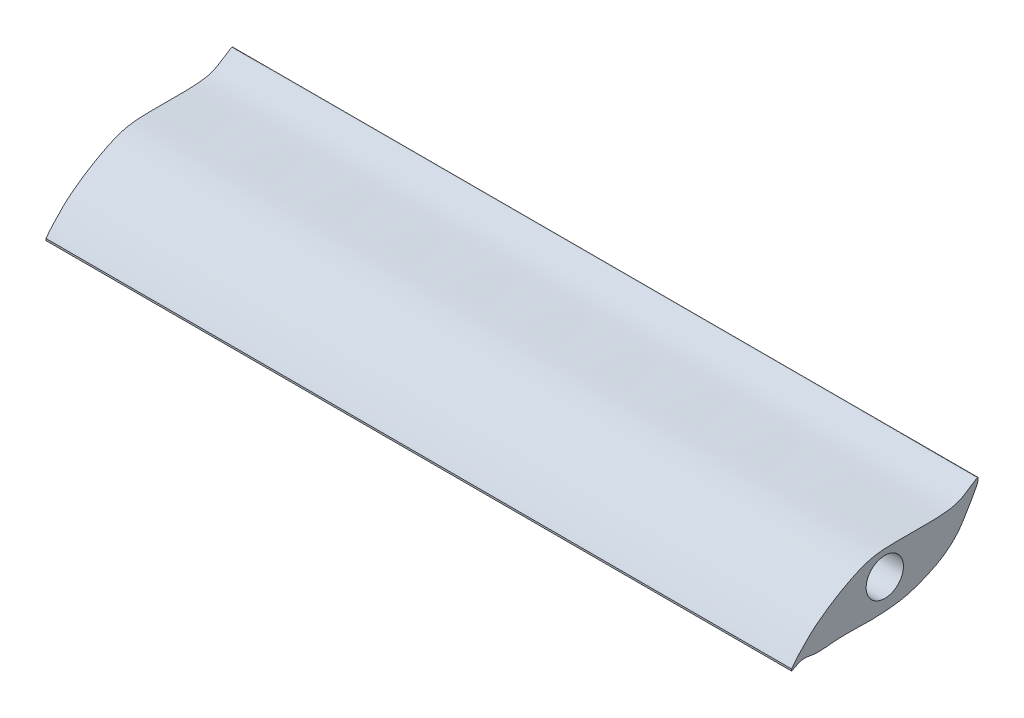
ISO-10303-21;
HEADER;
FILE_DESCRIPTION(('STEP AP214'),'2;1');
FILE_NAME('part.step','',(''),(''),'','','');
FILE_SCHEMA(('AUTOMOTIVE_DESIGN { 1 0 10303 214 1 1 1 1 }'));
ENDSEC;
DATA;
#1=APPLICATION_CONTEXT('core data for automotive mechanical design processes');
#2=APPLICATION_PROTOCOL_DEFINITION('international standard','automotive_design',2000,#1);
#3=PRODUCT_CONTEXT('',#1,'mechanical');
#4=PRODUCT('Part','Part','',(#3));
#5=PRODUCT_RELATED_PRODUCT_CATEGORY('part','',(#4));
#6=PRODUCT_DEFINITION_FORMATION('','',#4);
#7=PRODUCT_DEFINITION_CONTEXT('part definition',#1,'design');
#8=PRODUCT_DEFINITION('design','',#6,#7);
#9=PRODUCT_DEFINITION_SHAPE('','',#8);
#10=(LENGTH_UNIT() NAMED_UNIT(*) SI_UNIT(.MILLI.,.METRE.));
#11=(NAMED_UNIT(*) PLANE_ANGLE_UNIT() SI_UNIT($,.RADIAN.));
#12=(NAMED_UNIT(*) SI_UNIT($,.STERADIAN.) SOLID_ANGLE_UNIT());
#13=UNCERTAINTY_MEASURE_WITH_UNIT(LENGTH_MEASURE(1.E-05),#10,'distance_accuracy_value','');
#14=(GEOMETRIC_REPRESENTATION_CONTEXT(3) GLOBAL_UNCERTAINTY_ASSIGNED_CONTEXT((#13)) GLOBAL_UNIT_ASSIGNED_CONTEXT((#10,
#11,#12)) REPRESENTATION_CONTEXT('',''));
#15=CARTESIAN_POINT('',(0.,0.,0.));
#16=DIRECTION('',(0.,0.,1.));
#17=DIRECTION('',(1.,0.,0.));
#18=AXIS2_PLACEMENT_3D('',#15,#16,#17);
#19=CARTESIAN_POINT('',(50.,10.,-12.5));
#20=DIRECTION('',(-1.,0.,0.));
#21=DIRECTION('',(0.,0.,1.));
#22=AXIS2_PLACEMENT_3D('',#19,#20,#21);
#23=PLANE('',#22);
#24=CARTESIAN_POINT('',(50.,4.68747783797203,0.));
#25=DIRECTION('',(1.,0.,0.));
#26=DIRECTION('',(0.,0.,-1.));
#27=AXIS2_PLACEMENT_3D('',#24,#25,#26);
#28=CIRCLE('',#27,2.5);
#29=CARTESIAN_POINT('',(50.,4.68747783797203,-2.49999999999999));
#30=VERTEX_POINT('',#29);
#31=EDGE_CURVE('E136',#30,#30,#28,.T.);
#32=ORIENTED_EDGE('',*,*,#31,.F.);
#33=EDGE_LOOP('',(#32));
#34=FACE_BOUND('',#33,.T.);
#35=CARTESIAN_POINT('',(50.,0.,12.5));
#36=CARTESIAN_POINT('',(50.,0.0505909525154727,12.3095714462442));
#37=CARTESIAN_POINT('',(50.,0.853496137975972,11.1191477400608));
#38=CARTESIAN_POINT('',(50.,0.217248552112614,9.16863951643412));
#39=CARTESIAN_POINT('',(50.,0.751781994938175,6.42498448935654));
#40=CARTESIAN_POINT('',(50.,0.565528175692752,3.31005256994757));
#41=CARTESIAN_POINT('',(50.,0.598462484155129,0.192428753146038));
#42=CARTESIAN_POINT('',(50.,0.955309651411269,-2.95137379306609));
#43=CARTESIAN_POINT('',(50.,2.05734399254038,-5.84648168384962));
#44=CARTESIAN_POINT('',(50.,3.29384365054436,-8.17806777558693));
#45=CARTESIAN_POINT('',(50.,5.06347867764964,-9.979186998167));
#46=CARTESIAN_POINT('',(50.,6.85194167648177,-11.0533997702852));
#47=CARTESIAN_POINT('',(50.,11.1336555204317,-13.5699200463223));
#48=CARTESIAN_POINT('',(50.,8.51082596856558,-10.4191218151853));
#49=CARTESIAN_POINT('',(50.,8.00099794507966,-7.9131718769337));
#50=CARTESIAN_POINT('',(50.,8.02264938764246,-4.81055421615805));
#51=CARTESIAN_POINT('',(50.,8.02662364286193,-1.40561642102689));
#52=CARTESIAN_POINT('',(50.,7.984803810928,1.77524115155495));
#53=CARTESIAN_POINT('',(50.,6.61449638591342,4.74663763450107));
#54=CARTESIAN_POINT('',(50.,5.32010119566645,7.03105032868429));
#55=CARTESIAN_POINT('',(50.,3.83731609732269,9.08843489706636));
#56=CARTESIAN_POINT('',(50.,2.57459806859156,10.5650013430778));
#57=CARTESIAN_POINT('',(50.,-0.122781782519777,12.9621608431991));
#58=CARTESIAN_POINT('',(50.,0.,12.5));
#59=B_SPLINE_CURVE_WITH_KNOTS('',3,(#35,#36,#37,#38,#39,#40,#41,#42,#43,#44,#45,#46,#47,#48,#49,
#50,#51,#52,#53,#54,#55,#56,#57,#58),.UNSPECIFIED.,.T.,.F.,(4,1,1,1,1,1,1,1,1,1,1,1,1,1,1,1,1,1,
1,1,1,4),(0.,0.0223723162679839,0.0519405725869165,0.108024940918717,0.162660145847367,
0.215350044192618,0.270500486683988,0.326752240442378,0.375469283157597,0.408785139055256,
0.452001777653556,0.509743818199002,0.548425408917011,0.589864191643741,0.658193707073828,
0.703350788719513,0.769672760581713,0.820814366281576,0.87101676844652,0.909382783698528,
0.945703475939909,1.),.UNSPECIFIED.);
#60=CARTESIAN_POINT('',(50.,10.,-12.461085934828));
#61=VERTEX_POINT('',#60);
#62=CARTESIAN_POINT('',(50.,0.2438790571685,12.5));
#63=VERTEX_POINT('',#62);
#64=EDGE_CURVE('E61',#61,#63,#59,.T.);
#65=ORIENTED_EDGE('',*,*,#64,.T.);
#66=DIRECTION('',(0.,-1.,0.));
#67=VECTOR('',#66,1.);
#68=CARTESIAN_POINT('',(50.,10.,12.5));
#69=LINE('',#68,#67);
#70=CARTESIAN_POINT('',(50.,0.,12.5));
#71=VERTEX_POINT('',#70);
#72=EDGE_CURVE('E123',#63,#71,#69,.T.);
#73=ORIENTED_EDGE('',*,*,#72,.T.);
#74=CARTESIAN_POINT('',(50.,9.54799922694261,-12.5000000000001));
#75=VERTEX_POINT('',#74);
#76=EDGE_CURVE('E81',#71,#75,#59,.T.);
#77=ORIENTED_EDGE('',*,*,#76,.T.);
#78=DIRECTION('',(0.,-1.,0.));
#79=VECTOR('',#78,1.);
#80=CARTESIAN_POINT('',(50.,10.,-12.5));
#81=LINE('',#80,#79);
#82=CARTESIAN_POINT('',(50.,10.,-12.5));
#83=VERTEX_POINT('',#82);
#84=EDGE_CURVE('E12',#83,#75,#81,.T.);
#85=ORIENTED_EDGE('',*,*,#84,.F.);
#86=DIRECTION('',(0.,0.,-1.));
#87=VECTOR('',#86,1.);
#88=CARTESIAN_POINT('',(50.,10.,-12.5));
#89=LINE('',#88,#87);
#90=EDGE_CURVE('E107',#61,#83,#89,.T.);
#91=ORIENTED_EDGE('',*,*,#90,.F.);
#92=EDGE_LOOP('',(#65,#73,#77,#85,#91));
#93=FACE_BOUND('',#92,.T.);
#94=ADVANCED_FACE('F46',(#34,#93),#23,.F.);
#95=CARTESIAN_POINT('',(-50.,10.,-12.5));
#96=DIRECTION('',(0.,0.,1.));
#97=DIRECTION('',(1.,0.,0.));
#98=AXIS2_PLACEMENT_3D('',#95,#96,#97);
#99=PLANE('',#98);
#100=DIRECTION('',(1.,0.,0.));
#101=VECTOR('',#100,1.);
#102=CARTESIAN_POINT('',(-50.,9.5479992269426,-12.5000000000001));
#103=LINE('',#102,#101);
#104=CARTESIAN_POINT('',(-50.,9.54799923471461,-12.5000000028297));
#105=VERTEX_POINT('',#104);
#106=EDGE_CURVE('E140',#105,#75,#103,.T.);
#107=ORIENTED_EDGE('',*,*,#106,.F.);
#108=DIRECTION('',(0.,-1.,0.));
#109=VECTOR('',#108,1.);
#110=CARTESIAN_POINT('',(-50.,10.,-12.5));
#111=LINE('',#110,#109);
#112=CARTESIAN_POINT('',(-50.,10.,-12.5));
#113=VERTEX_POINT('',#112);
#114=EDGE_CURVE('E54',#113,#105,#111,.T.);
#115=ORIENTED_EDGE('',*,*,#114,.F.);
#116=DIRECTION('',(-1.,0.,0.));
#117=VECTOR('',#116,1.);
#118=CARTESIAN_POINT('',(-50.,10.,-12.5));
#119=LINE('',#118,#117);
#120=EDGE_CURVE('E70',#83,#113,#119,.T.);
#121=ORIENTED_EDGE('',*,*,#120,.F.);
#122=ORIENTED_EDGE('',*,*,#84,.T.);
#123=EDGE_LOOP('',(#107,#115,#121,#122));
#124=FACE_BOUND('',#123,.T.);
#125=ADVANCED_FACE('F176',(#124),#99,.F.);
#126=CARTESIAN_POINT('',(-50.,10.,-12.5));
#127=DIRECTION('',(1.,0.,0.));
#128=DIRECTION('',(0.,0.,-1.));
#129=AXIS2_PLACEMENT_3D('',#126,#127,#128);
#130=PLANE('',#129);
#131=CARTESIAN_POINT('',(-50.,4.68747783797203,0.));
#132=DIRECTION('',(1.,0.,0.));
#133=DIRECTION('',(0.,0.,-1.));
#134=AXIS2_PLACEMENT_3D('',#131,#132,#133);
#135=CIRCLE('',#134,2.5);
#136=CARTESIAN_POINT('',(-50.,4.68747783797203,-2.50000000000001));
#137=VERTEX_POINT('',#136);
#138=EDGE_CURVE('E108',#137,#137,#135,.T.);
#139=ORIENTED_EDGE('',*,*,#138,.T.);
#140=EDGE_LOOP('',(#139));
#141=FACE_BOUND('',#140,.T.);
#142=CARTESIAN_POINT('',(-50.,0.,12.5));
#143=CARTESIAN_POINT('',(-50.,0.0505909525154727,12.3095714462442));
#144=CARTESIAN_POINT('',(-50.,0.853496137975972,11.1191477400608));
#145=CARTESIAN_POINT('',(-50.,0.217248552112614,9.16863951643409));
#146=CARTESIAN_POINT('',(-50.,0.751781994938175,6.42498448935651));
#147=CARTESIAN_POINT('',(-50.,0.565528175692752,3.31005256994755));
#148=CARTESIAN_POINT('',(-50.,0.598462484155129,0.19242875314601));
#149=CARTESIAN_POINT('',(-50.,0.955309651411269,-2.95137379306611));
#150=CARTESIAN_POINT('',(-50.,2.05734399254038,-5.84648168384965));
#151=CARTESIAN_POINT('',(-50.,3.29384365054436,-8.17806777558696));
#152=CARTESIAN_POINT('',(-50.,5.06347867764964,-9.97918699816703));
#153=CARTESIAN_POINT('',(-50.,6.85194167648177,-11.0533997702852));
#154=CARTESIAN_POINT('',(-50.,11.1336555204317,-13.5699200463224));
#155=CARTESIAN_POINT('',(-50.,8.51082596856558,-10.4191218151853));
#156=CARTESIAN_POINT('',(-50.,8.00099794507966,-7.91317187693373));
#157=CARTESIAN_POINT('',(-50.,8.02264938764246,-4.81055421615808));
#158=CARTESIAN_POINT('',(-50.,8.02662364286193,-1.40561642102692));
#159=CARTESIAN_POINT('',(-50.,7.984803810928,1.77524115155492));
#160=CARTESIAN_POINT('',(-50.,6.61449638591342,4.74663763450104));
#161=CARTESIAN_POINT('',(-50.,5.32010119566645,7.03105032868426));
#162=CARTESIAN_POINT('',(-50.,3.83731609732269,9.08843489706634));
#163=CARTESIAN_POINT('',(-50.,2.57459806859156,10.5650013430778));
#164=CARTESIAN_POINT('',(-50.,-0.122781782519777,12.9621608431991));
#165=CARTESIAN_POINT('',(-50.,0.,12.5));
#166=B_SPLINE_CURVE_WITH_KNOTS('',3,(#142,#143,#144,#145,#146,#147,#148,#149,#150,#151,#152,
#153,#154,#155,#156,#157,#158,#159,#160,#161,#162,#163,#164,#165),.UNSPECIFIED.,.T.,.F.,(4,1,1,
1,1,1,1,1,1,1,1,1,1,1,1,1,1,1,1,1,1,4),(0.,0.0223723162679839,0.0519405725869165,
0.108024940918717,0.162660145847367,0.215350044192618,0.270500486683988,0.326752240442378,
0.375469283157597,0.408785139055256,0.452001777653556,0.509743818199002,0.548425408917011,
0.589864191643741,0.658193707073828,0.703350788719513,0.769672760581713,0.820814366281576,
0.87101676844652,0.909382783698528,0.945703475939909,1.),.UNSPECIFIED.);
#167=CARTESIAN_POINT('',(-50.,0.,12.5));
#168=VERTEX_POINT('',#167);
#169=EDGE_CURVE('E101',#168,#105,#166,.T.);
#170=ORIENTED_EDGE('',*,*,#169,.F.);
#171=DIRECTION('',(0.,-1.,0.));
#172=VECTOR('',#171,1.);
#173=CARTESIAN_POINT('',(-50.,10.,12.5));
#174=LINE('',#173,#172);
#175=CARTESIAN_POINT('',(-50.,0.243879057168484,12.5));
#176=VERTEX_POINT('',#175);
#177=EDGE_CURVE('E115',#176,#168,#174,.T.);
#178=ORIENTED_EDGE('',*,*,#177,.F.);
#179=CARTESIAN_POINT('',(-50.,10.0000000000075,-12.461085934828));
#180=VERTEX_POINT('',#179);
#181=EDGE_CURVE('E119',#180,#176,#166,.T.);
#182=ORIENTED_EDGE('',*,*,#181,.F.);
#183=DIRECTION('',(0.,0.,1.));
#184=VECTOR('',#183,1.);
#185=CARTESIAN_POINT('',(-50.,10.,-12.5));
#186=LINE('',#185,#184);
#187=EDGE_CURVE('E127',#113,#180,#186,.T.);
#188=ORIENTED_EDGE('',*,*,#187,.F.);
#189=ORIENTED_EDGE('',*,*,#114,.T.);
#190=EDGE_LOOP('',(#170,#178,#182,#188,#189));
#191=FACE_BOUND('',#190,.T.);
#192=ADVANCED_FACE('F113',(#141,#191),#130,.F.);
#193=CARTESIAN_POINT('',(-50.,10.,12.5));
#194=DIRECTION('',(0.,0.,-1.));
#195=DIRECTION('',(-1.,0.,0.));
#196=AXIS2_PLACEMENT_3D('',#193,#194,#195);
#197=PLANE('',#196);
#198=DIRECTION('',(1.,0.,0.));
#199=VECTOR('',#198,1.);
#200=CARTESIAN_POINT('',(-50.,0.243879057168492,12.5));
#201=LINE('',#200,#199);
#202=EDGE_CURVE('E86',#176,#63,#201,.T.);
#203=ORIENTED_EDGE('',*,*,#202,.F.);
#204=ORIENTED_EDGE('',*,*,#177,.T.);
#205=DIRECTION('',(1.,0.,0.));
#206=VECTOR('',#205,1.);
#207=CARTESIAN_POINT('',(-50.,0.,12.5));
#208=LINE('',#207,#206);
#209=EDGE_CURVE('E98',#168,#71,#208,.T.);
#210=ORIENTED_EDGE('',*,*,#209,.T.);
#211=ORIENTED_EDGE('',*,*,#72,.F.);
#212=EDGE_LOOP('',(#203,#204,#210,#211));
#213=FACE_BOUND('',#212,.T.);
#214=ADVANCED_FACE('F121',(#213),#197,.F.);
#215=CARTESIAN_POINT('',(0.,10.,0.));
#216=DIRECTION('',(0.,1.,0.));
#217=DIRECTION('',(0.,0.,1.));
#218=AXIS2_PLACEMENT_3D('',#215,#216,#217);
#219=PLANE('',#218);
#220=ORIENTED_EDGE('',*,*,#187,.T.);
#221=DIRECTION('',(1.,0.,0.));
#222=VECTOR('',#221,1.);
#223=CARTESIAN_POINT('',(-50.,10.0000000000075,-12.461085934828));
#224=LINE('',#223,#222);
#225=EDGE_CURVE('E118',#180,#61,#224,.T.);
#226=ORIENTED_EDGE('',*,*,#225,.T.);
#227=ORIENTED_EDGE('',*,*,#90,.T.);
#228=ORIENTED_EDGE('',*,*,#120,.T.);
#229=EDGE_LOOP('',(#220,#226,#227,#228));
#230=FACE_BOUND('',#229,.T.);
#231=ADVANCED_FACE('F169',(#230),#219,.T.);
#232=CARTESIAN_POINT('',(-50.,4.68747783797203,0.));
#233=DIRECTION('',(1.,0.,0.));
#234=DIRECTION('',(0.,0.,-1.));
#235=AXIS2_PLACEMENT_3D('',#232,#233,#234);
#236=CYLINDRICAL_SURFACE('',#235,2.5);
#237=ORIENTED_EDGE('',*,*,#138,.F.);
#238=EDGE_LOOP('',(#237));
#239=FACE_BOUND('',#238,.T.);
#240=ORIENTED_EDGE('',*,*,#31,.T.);
#241=EDGE_LOOP('',(#240));
#242=FACE_BOUND('',#241,.T.);
#243=ADVANCED_FACE('F166',(#239,#242),#236,.F.);
#244=DIRECTION('',(1.,0.,0.));
#245=VECTOR('',#244,1.);
#246=SURFACE_OF_LINEAR_EXTRUSION('',#166,#245);
#247=ORIENTED_EDGE('',*,*,#106,.T.);
#248=ORIENTED_EDGE('',*,*,#76,.F.);
#249=ORIENTED_EDGE('',*,*,#209,.F.);
#250=ORIENTED_EDGE('',*,*,#169,.T.);
#251=EDGE_LOOP('',(#247,#248,#249,#250));
#252=FACE_BOUND('',#251,.T.);
#253=ADVANCED_FACE('F100',(#252),#246,.T.);
#254=ORIENTED_EDGE('',*,*,#202,.T.);
#255=ORIENTED_EDGE('',*,*,#64,.F.);
#256=ORIENTED_EDGE('',*,*,#225,.F.);
#257=ORIENTED_EDGE('',*,*,#181,.T.);
#258=EDGE_LOOP('',(#254,#255,#256,#257));
#259=FACE_BOUND('',#258,.T.);
#260=ADVANCED_FACE('F165',(#259),#246,.T.);
#261=CLOSED_SHELL('',(#94,#125,#192,#214,#231,#243,#253,#260));
#262=MANIFOLD_SOLID_BREP('B2',#261);
#263=ADVANCED_BREP_SHAPE_REPRESENTATION('',(#18,#262),#14);
#264=SHAPE_DEFINITION_REPRESENTATION(#9,#263);
ENDSEC;
END-ISO-10303-21;
